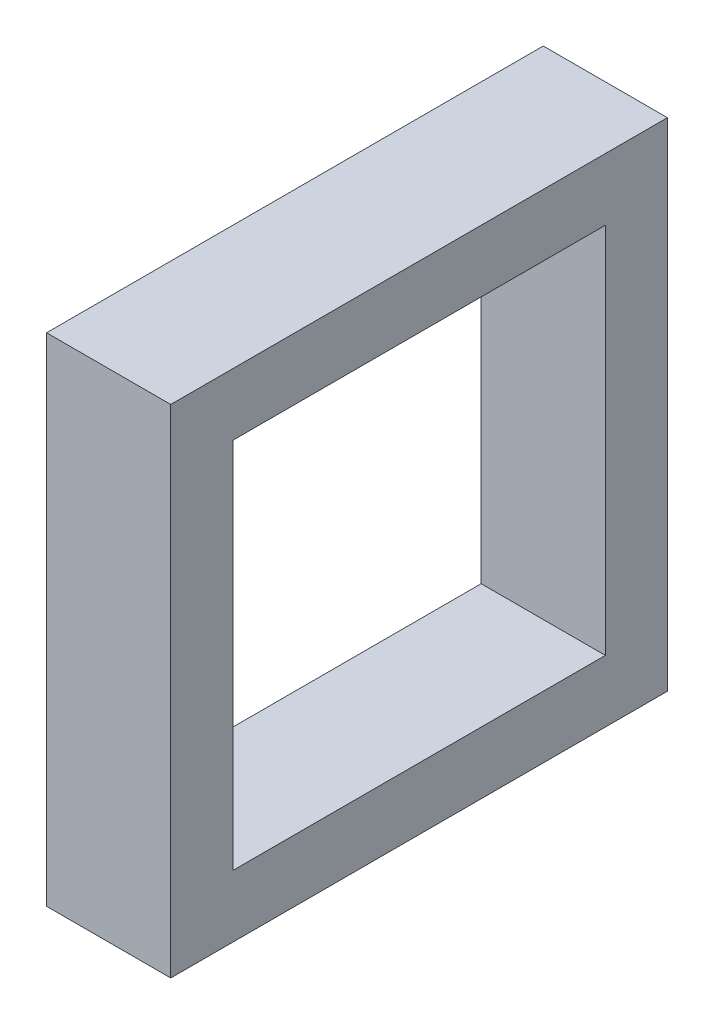
ISO-10303-21;
HEADER;
FILE_DESCRIPTION(('STEP AP214'),'2;1');
FILE_NAME('part.step','',(''),(''),'','','');
FILE_SCHEMA(('AUTOMOTIVE_DESIGN { 1 0 10303 214 1 1 1 1 }'));
ENDSEC;
DATA;
#1=APPLICATION_CONTEXT('core data for automotive mechanical design processes');
#2=APPLICATION_PROTOCOL_DEFINITION('international standard','automotive_design',2000,#1);
#3=PRODUCT_CONTEXT('',#1,'mechanical');
#4=PRODUCT('Part','Part','',(#3));
#5=PRODUCT_RELATED_PRODUCT_CATEGORY('part','',(#4));
#6=PRODUCT_DEFINITION_FORMATION('','',#4);
#7=PRODUCT_DEFINITION_CONTEXT('part definition',#1,'design');
#8=PRODUCT_DEFINITION('design','',#6,#7);
#9=PRODUCT_DEFINITION_SHAPE('','',#8);
#10=(LENGTH_UNIT() NAMED_UNIT(*) SI_UNIT(.MILLI.,.METRE.));
#11=(NAMED_UNIT(*) PLANE_ANGLE_UNIT() SI_UNIT($,.RADIAN.));
#12=(NAMED_UNIT(*) SI_UNIT($,.STERADIAN.) SOLID_ANGLE_UNIT());
#13=UNCERTAINTY_MEASURE_WITH_UNIT(LENGTH_MEASURE(1.E-05),#10,'distance_accuracy_value','');
#14=(GEOMETRIC_REPRESENTATION_CONTEXT(3) GLOBAL_UNCERTAINTY_ASSIGNED_CONTEXT((#13)) GLOBAL_UNIT_ASSIGNED_CONTEXT((#10,
#11,#12)) REPRESENTATION_CONTEXT('',''));
#15=CARTESIAN_POINT('',(0.,0.,0.));
#16=DIRECTION('',(0.,0.,1.));
#17=DIRECTION('',(1.,0.,0.));
#18=AXIS2_PLACEMENT_3D('',#15,#16,#17);
#19=CARTESIAN_POINT('',(1.,0.,0.));
#20=DIRECTION('',(-1.,0.,0.));
#21=DIRECTION('',(0.,0.,1.));
#22=AXIS2_PLACEMENT_3D('',#19,#20,#21);
#23=PLANE('',#22);
#24=DIRECTION('',(0.,1.,0.));
#25=VECTOR('',#24,1.);
#26=CARTESIAN_POINT('',(1.,-2.,-2.));
#27=LINE('',#26,#25);
#28=CARTESIAN_POINT('',(1.,-2.,-2.));
#29=VERTEX_POINT('',#28);
#30=CARTESIAN_POINT('',(1.,2.,-2.));
#31=VERTEX_POINT('',#30);
#32=EDGE_CURVE('E135',#29,#31,#27,.T.);
#33=ORIENTED_EDGE('',*,*,#32,.T.);
#34=DIRECTION('',(0.,0.,1.));
#35=VECTOR('',#34,1.);
#36=CARTESIAN_POINT('',(1.,2.,2.));
#37=LINE('',#36,#35);
#38=CARTESIAN_POINT('',(1.,2.,2.));
#39=VERTEX_POINT('',#38);
#40=EDGE_CURVE('E138',#31,#39,#37,.T.);
#41=ORIENTED_EDGE('',*,*,#40,.T.);
#42=DIRECTION('',(0.,-1.,0.));
#43=VECTOR('',#42,1.);
#44=CARTESIAN_POINT('',(1.,-2.,2.));
#45=LINE('',#44,#43);
#46=CARTESIAN_POINT('',(1.,-2.,2.));
#47=VERTEX_POINT('',#46);
#48=EDGE_CURVE('E141',#39,#47,#45,.T.);
#49=ORIENTED_EDGE('',*,*,#48,.T.);
#50=DIRECTION('',(0.,0.,-1.));
#51=VECTOR('',#50,1.);
#52=CARTESIAN_POINT('',(1.,-2.,2.));
#53=LINE('',#52,#51);
#54=EDGE_CURVE('E143',#47,#29,#53,.T.);
#55=ORIENTED_EDGE('',*,*,#54,.T.);
#56=EDGE_LOOP('',(#33,#41,#49,#55));
#57=FACE_BOUND('',#56,.T.);
#58=DIRECTION('',(0.,-1.,0.));
#59=VECTOR('',#58,1.);
#60=CARTESIAN_POINT('',(1.,-1.5,1.5));
#61=LINE('',#60,#59);
#62=CARTESIAN_POINT('',(1.,1.5,1.5));
#63=VERTEX_POINT('',#62);
#64=CARTESIAN_POINT('',(1.,-1.5,1.5));
#65=VERTEX_POINT('',#64);
#66=EDGE_CURVE('E99',#63,#65,#61,.T.);
#67=ORIENTED_EDGE('',*,*,#66,.F.);
#68=DIRECTION('',(0.,0.,1.));
#69=VECTOR('',#68,1.);
#70=CARTESIAN_POINT('',(1.,1.5,-1.5));
#71=LINE('',#70,#69);
#72=CARTESIAN_POINT('',(1.,1.5,-1.5));
#73=VERTEX_POINT('',#72);
#74=EDGE_CURVE('E121',#73,#63,#71,.T.);
#75=ORIENTED_EDGE('',*,*,#74,.F.);
#76=DIRECTION('',(0.,1.,0.));
#77=VECTOR('',#76,1.);
#78=CARTESIAN_POINT('',(1.,-1.5,-1.5));
#79=LINE('',#78,#77);
#80=CARTESIAN_POINT('',(1.,-1.5,-1.5));
#81=VERTEX_POINT('',#80);
#82=EDGE_CURVE('E119',#81,#73,#79,.T.);
#83=ORIENTED_EDGE('',*,*,#82,.F.);
#84=DIRECTION('',(0.,0.,-1.));
#85=VECTOR('',#84,1.);
#86=CARTESIAN_POINT('',(1.,-1.5,-1.5));
#87=LINE('',#86,#85);
#88=EDGE_CURVE('E107',#65,#81,#87,.T.);
#89=ORIENTED_EDGE('',*,*,#88,.F.);
#90=EDGE_LOOP('',(#67,#75,#83,#89));
#91=FACE_BOUND('',#90,.T.);
#92=ADVANCED_FACE('F34',(#57,#91),#23,.F.);
#93=CARTESIAN_POINT('',(0.,0.,0.));
#94=DIRECTION('',(-1.,0.,0.));
#95=DIRECTION('',(0.,0.,1.));
#96=AXIS2_PLACEMENT_3D('',#93,#94,#95);
#97=PLANE('',#96);
#98=DIRECTION('',(0.,1.,0.));
#99=VECTOR('',#98,1.);
#100=CARTESIAN_POINT('',(0.,-2.,-2.));
#101=LINE('',#100,#99);
#102=CARTESIAN_POINT('',(0.,-2.,-2.));
#103=VERTEX_POINT('',#102);
#104=CARTESIAN_POINT('',(0.,2.,-2.));
#105=VERTEX_POINT('',#104);
#106=EDGE_CURVE('E115',#103,#105,#101,.T.);
#107=ORIENTED_EDGE('',*,*,#106,.F.);
#108=DIRECTION('',(0.,0.,-1.));
#109=VECTOR('',#108,1.);
#110=CARTESIAN_POINT('',(0.,-2.,2.));
#111=LINE('',#110,#109);
#112=CARTESIAN_POINT('',(0.,-2.,2.));
#113=VERTEX_POINT('',#112);
#114=EDGE_CURVE('E139',#113,#103,#111,.T.);
#115=ORIENTED_EDGE('',*,*,#114,.F.);
#116=DIRECTION('',(0.,-1.,0.));
#117=VECTOR('',#116,1.);
#118=CARTESIAN_POINT('',(0.,-2.,2.));
#119=LINE('',#118,#117);
#120=CARTESIAN_POINT('',(0.,2.,2.));
#121=VERTEX_POINT('',#120);
#122=EDGE_CURVE('E150',#121,#113,#119,.T.);
#123=ORIENTED_EDGE('',*,*,#122,.F.);
#124=DIRECTION('',(0.,0.,1.));
#125=VECTOR('',#124,1.);
#126=CARTESIAN_POINT('',(0.,2.,2.));
#127=LINE('',#126,#125);
#128=EDGE_CURVE('E148',#105,#121,#127,.T.);
#129=ORIENTED_EDGE('',*,*,#128,.F.);
#130=EDGE_LOOP('',(#107,#115,#123,#129));
#131=FACE_BOUND('',#130,.T.);
#132=DIRECTION('',(0.,0.,1.));
#133=VECTOR('',#132,1.);
#134=CARTESIAN_POINT('',(0.,1.5,-1.5));
#135=LINE('',#134,#133);
#136=CARTESIAN_POINT('',(0.,1.5,-1.5));
#137=VERTEX_POINT('',#136);
#138=CARTESIAN_POINT('',(0.,1.5,1.5));
#139=VERTEX_POINT('',#138);
#140=EDGE_CURVE('E108',#137,#139,#135,.T.);
#141=ORIENTED_EDGE('',*,*,#140,.T.);
#142=DIRECTION('',(0.,-1.,0.));
#143=VECTOR('',#142,1.);
#144=CARTESIAN_POINT('',(0.,-1.5,1.5));
#145=LINE('',#144,#143);
#146=CARTESIAN_POINT('',(0.,-1.5,1.5));
#147=VERTEX_POINT('',#146);
#148=EDGE_CURVE('E57',#139,#147,#145,.T.);
#149=ORIENTED_EDGE('',*,*,#148,.T.);
#150=DIRECTION('',(0.,0.,-1.));
#151=VECTOR('',#150,1.);
#152=CARTESIAN_POINT('',(0.,-1.5,-1.5));
#153=LINE('',#152,#151);
#154=CARTESIAN_POINT('',(0.,-1.5,-1.5));
#155=VERTEX_POINT('',#154);
#156=EDGE_CURVE('E114',#147,#155,#153,.T.);
#157=ORIENTED_EDGE('',*,*,#156,.T.);
#158=DIRECTION('',(0.,1.,0.));
#159=VECTOR('',#158,1.);
#160=CARTESIAN_POINT('',(0.,-1.5,-1.5));
#161=LINE('',#160,#159);
#162=EDGE_CURVE('E127',#155,#137,#161,.T.);
#163=ORIENTED_EDGE('',*,*,#162,.T.);
#164=EDGE_LOOP('',(#141,#149,#157,#163));
#165=FACE_BOUND('',#164,.T.);
#166=ADVANCED_FACE('F168',(#131,#165),#97,.T.);
#167=CARTESIAN_POINT('',(1.,-2.,-2.));
#168=DIRECTION('',(0.,0.,1.));
#169=DIRECTION('',(1.,0.,0.));
#170=AXIS2_PLACEMENT_3D('',#167,#168,#169);
#171=PLANE('',#170);
#172=ORIENTED_EDGE('',*,*,#106,.T.);
#173=DIRECTION('',(-1.,0.,0.));
#174=VECTOR('',#173,1.);
#175=CARTESIAN_POINT('',(1.,2.,-2.));
#176=LINE('',#175,#174);
#177=EDGE_CURVE('E11',#31,#105,#176,.T.);
#178=ORIENTED_EDGE('',*,*,#177,.F.);
#179=ORIENTED_EDGE('',*,*,#32,.F.);
#180=DIRECTION('',(-1.,0.,0.));
#181=VECTOR('',#180,1.);
#182=CARTESIAN_POINT('',(1.,-2.,-2.));
#183=LINE('',#182,#181);
#184=EDGE_CURVE('E145',#29,#103,#183,.T.);
#185=ORIENTED_EDGE('',*,*,#184,.T.);
#186=EDGE_LOOP('',(#172,#178,#179,#185));
#187=FACE_BOUND('',#186,.T.);
#188=ADVANCED_FACE('F36',(#187),#171,.F.);
#189=CARTESIAN_POINT('',(1.,2.,2.));
#190=DIRECTION('',(0.,-1.,0.));
#191=DIRECTION('',(0.,0.,-1.));
#192=AXIS2_PLACEMENT_3D('',#189,#190,#191);
#193=PLANE('',#192);
#194=ORIENTED_EDGE('',*,*,#128,.T.);
#195=DIRECTION('',(-1.,0.,0.));
#196=VECTOR('',#195,1.);
#197=CARTESIAN_POINT('',(1.,2.,2.));
#198=LINE('',#197,#196);
#199=EDGE_CURVE('E42',#39,#121,#198,.T.);
#200=ORIENTED_EDGE('',*,*,#199,.F.);
#201=ORIENTED_EDGE('',*,*,#40,.F.);
#202=ORIENTED_EDGE('',*,*,#177,.T.);
#203=EDGE_LOOP('',(#194,#200,#201,#202));
#204=FACE_BOUND('',#203,.T.);
#205=ADVANCED_FACE('F178',(#204),#193,.F.);
#206=CARTESIAN_POINT('',(1.,-2.,2.));
#207=DIRECTION('',(0.,0.,-1.));
#208=DIRECTION('',(-1.,0.,0.));
#209=AXIS2_PLACEMENT_3D('',#206,#207,#208);
#210=PLANE('',#209);
#211=ORIENTED_EDGE('',*,*,#122,.T.);
#212=DIRECTION('',(-1.,0.,0.));
#213=VECTOR('',#212,1.);
#214=CARTESIAN_POINT('',(1.,-2.,2.));
#215=LINE('',#214,#213);
#216=EDGE_CURVE('E155',#47,#113,#215,.T.);
#217=ORIENTED_EDGE('',*,*,#216,.F.);
#218=ORIENTED_EDGE('',*,*,#48,.F.);
#219=ORIENTED_EDGE('',*,*,#199,.T.);
#220=EDGE_LOOP('',(#211,#217,#218,#219));
#221=FACE_BOUND('',#220,.T.);
#222=ADVANCED_FACE('F162',(#221),#210,.F.);
#223=CARTESIAN_POINT('',(1.,-2.,2.));
#224=DIRECTION('',(0.,1.,0.));
#225=DIRECTION('',(0.,0.,1.));
#226=AXIS2_PLACEMENT_3D('',#223,#224,#225);
#227=PLANE('',#226);
#228=ORIENTED_EDGE('',*,*,#114,.T.);
#229=ORIENTED_EDGE('',*,*,#184,.F.);
#230=ORIENTED_EDGE('',*,*,#54,.F.);
#231=ORIENTED_EDGE('',*,*,#216,.T.);
#232=EDGE_LOOP('',(#228,#229,#230,#231));
#233=FACE_BOUND('',#232,.T.);
#234=ADVANCED_FACE('F172',(#233),#227,.F.);
#235=CARTESIAN_POINT('',(1.,-1.5,1.5));
#236=DIRECTION('',(0.,0.,-1.));
#237=DIRECTION('',(-1.,0.,0.));
#238=AXIS2_PLACEMENT_3D('',#235,#236,#237);
#239=PLANE('',#238);
#240=ORIENTED_EDGE('',*,*,#148,.F.);
#241=DIRECTION('',(-1.,0.,0.));
#242=VECTOR('',#241,1.);
#243=CARTESIAN_POINT('',(1.,1.5,1.5));
#244=LINE('',#243,#242);
#245=EDGE_CURVE('E103',#63,#139,#244,.T.);
#246=ORIENTED_EDGE('',*,*,#245,.F.);
#247=ORIENTED_EDGE('',*,*,#66,.T.);
#248=DIRECTION('',(-1.,0.,0.));
#249=VECTOR('',#248,1.);
#250=CARTESIAN_POINT('',(1.,-1.5,1.5));
#251=LINE('',#250,#249);
#252=EDGE_CURVE('E102',#65,#147,#251,.T.);
#253=ORIENTED_EDGE('',*,*,#252,.T.);
#254=EDGE_LOOP('',(#240,#246,#247,#253));
#255=FACE_BOUND('',#254,.T.);
#256=ADVANCED_FACE('F101',(#255),#239,.T.);
#257=CARTESIAN_POINT('',(1.,-1.5,-1.5));
#258=DIRECTION('',(0.,1.,0.));
#259=DIRECTION('',(0.,0.,1.));
#260=AXIS2_PLACEMENT_3D('',#257,#258,#259);
#261=PLANE('',#260);
#262=ORIENTED_EDGE('',*,*,#156,.F.);
#263=ORIENTED_EDGE('',*,*,#252,.F.);
#264=ORIENTED_EDGE('',*,*,#88,.T.);
#265=DIRECTION('',(-1.,0.,0.));
#266=VECTOR('',#265,1.);
#267=CARTESIAN_POINT('',(1.,-1.5,-1.5));
#268=LINE('',#267,#266);
#269=EDGE_CURVE('E116',#81,#155,#268,.T.);
#270=ORIENTED_EDGE('',*,*,#269,.T.);
#271=EDGE_LOOP('',(#262,#263,#264,#270));
#272=FACE_BOUND('',#271,.T.);
#273=ADVANCED_FACE('F111',(#272),#261,.T.);
#274=CARTESIAN_POINT('',(1.,-1.5,-1.5));
#275=DIRECTION('',(0.,0.,1.));
#276=DIRECTION('',(1.,0.,0.));
#277=AXIS2_PLACEMENT_3D('',#274,#275,#276);
#278=PLANE('',#277);
#279=ORIENTED_EDGE('',*,*,#162,.F.);
#280=ORIENTED_EDGE('',*,*,#269,.F.);
#281=ORIENTED_EDGE('',*,*,#82,.T.);
#282=DIRECTION('',(-1.,0.,0.));
#283=VECTOR('',#282,1.);
#284=CARTESIAN_POINT('',(1.,1.5,-1.5));
#285=LINE('',#284,#283);
#286=EDGE_CURVE('E49',#73,#137,#285,.T.);
#287=ORIENTED_EDGE('',*,*,#286,.T.);
#288=EDGE_LOOP('',(#279,#280,#281,#287));
#289=FACE_BOUND('',#288,.T.);
#290=ADVANCED_FACE('F201',(#289),#278,.T.);
#291=CARTESIAN_POINT('',(1.,1.5,-1.5));
#292=DIRECTION('',(0.,-1.,0.));
#293=DIRECTION('',(0.,0.,-1.));
#294=AXIS2_PLACEMENT_3D('',#291,#292,#293);
#295=PLANE('',#294);
#296=ORIENTED_EDGE('',*,*,#140,.F.);
#297=ORIENTED_EDGE('',*,*,#286,.F.);
#298=ORIENTED_EDGE('',*,*,#74,.T.);
#299=ORIENTED_EDGE('',*,*,#245,.T.);
#300=EDGE_LOOP('',(#296,#297,#298,#299));
#301=FACE_BOUND('',#300,.T.);
#302=ADVANCED_FACE('F205',(#301),#295,.T.);
#303=CLOSED_SHELL('',(#92,#166,#188,#205,#222,#234,#256,#273,#290,#302));
#304=MANIFOLD_SOLID_BREP('B2',#303);
#305=ADVANCED_BREP_SHAPE_REPRESENTATION('',(#18,#304),#14);
#306=SHAPE_DEFINITION_REPRESENTATION(#9,#305);
ENDSEC;
END-ISO-10303-21;
